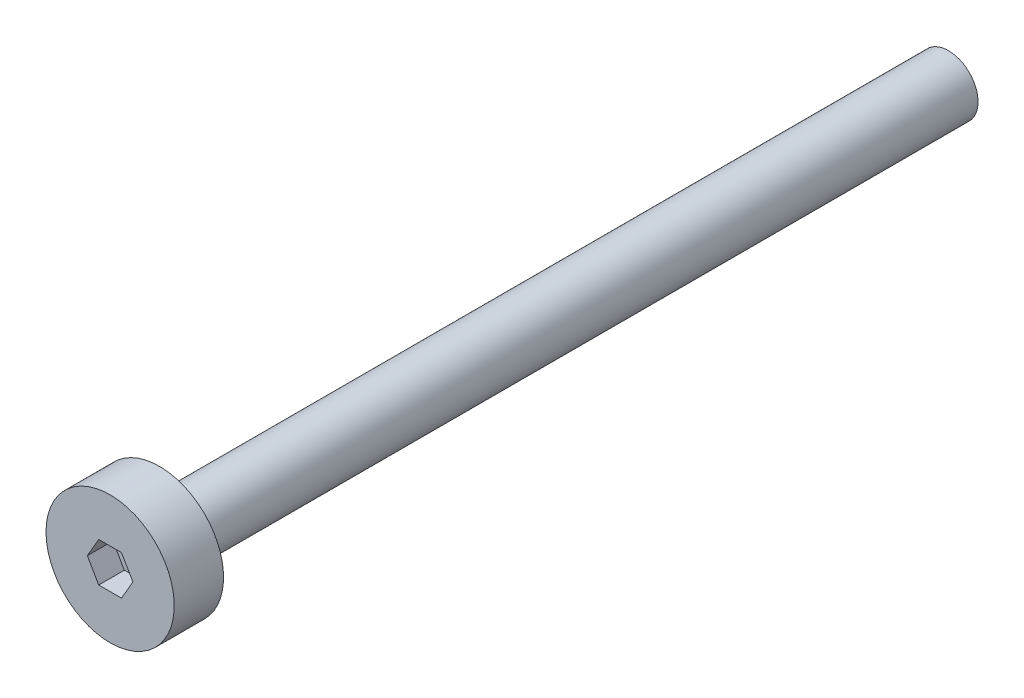
ISO-10303-21;
HEADER;
FILE_DESCRIPTION(('STEP AP214'),'2;1');
FILE_NAME('part.step','',(''),(''),'','','');
FILE_SCHEMA(('AUTOMOTIVE_DESIGN { 1 0 10303 214 1 1 1 1 }'));
ENDSEC;
DATA;
#1=APPLICATION_CONTEXT('core data for automotive mechanical design processes');
#2=APPLICATION_PROTOCOL_DEFINITION('international standard','automotive_design',2000,#1);
#3=PRODUCT_CONTEXT('',#1,'mechanical');
#4=PRODUCT('Part','Part','',(#3));
#5=PRODUCT_RELATED_PRODUCT_CATEGORY('part','',(#4));
#6=PRODUCT_DEFINITION_FORMATION('','',#4);
#7=PRODUCT_DEFINITION_CONTEXT('part definition',#1,'design');
#8=PRODUCT_DEFINITION('design','',#6,#7);
#9=PRODUCT_DEFINITION_SHAPE('','',#8);
#10=(LENGTH_UNIT() NAMED_UNIT(*) SI_UNIT(.MILLI.,.METRE.));
#11=(NAMED_UNIT(*) PLANE_ANGLE_UNIT() SI_UNIT($,.RADIAN.));
#12=(NAMED_UNIT(*) SI_UNIT($,.STERADIAN.) SOLID_ANGLE_UNIT());
#13=UNCERTAINTY_MEASURE_WITH_UNIT(LENGTH_MEASURE(1.E-05),#10,'distance_accuracy_value','');
#14=(GEOMETRIC_REPRESENTATION_CONTEXT(3) GLOBAL_UNCERTAINTY_ASSIGNED_CONTEXT((#13)) GLOBAL_UNIT_ASSIGNED_CONTEXT((#10,
#11,#12)) REPRESENTATION_CONTEXT('',''));
#15=CARTESIAN_POINT('',(0.,0.,0.));
#16=DIRECTION('',(0.,0.,1.));
#17=DIRECTION('',(1.,0.,0.));
#18=AXIS2_PLACEMENT_3D('',#15,#16,#17);
#19=CARTESIAN_POINT('',(0.,0.,1.2));
#20=DIRECTION('',(0.,0.,1.));
#21=DIRECTION('',(1.,0.,0.));
#22=AXIS2_PLACEMENT_3D('',#19,#20,#21);
#23=PLANE('',#22);
#24=DIRECTION('',(-0.50000000000019,0.866025403784329,0.));
#25=VECTOR('',#24,1.);
#26=CARTESIAN_POINT('',(1.154700538379,0.,1.2));
#27=LINE('',#26,#25);
#28=CARTESIAN_POINT('',(1.154700538379,0.,1.2));
#29=VERTEX_POINT('',#28);
#30=CARTESIAN_POINT('',(0.57735026919,1.,1.2));
#31=VERTEX_POINT('',#30);
#32=EDGE_CURVE('E9',#29,#31,#27,.T.);
#33=ORIENTED_EDGE('',*,*,#32,.T.);
#34=DIRECTION('',(-1.,0.,0.));
#35=VECTOR('',#34,1.);
#36=CARTESIAN_POINT('',(0.57735026919,1.,1.2));
#37=LINE('',#36,#35);
#38=CARTESIAN_POINT('',(-0.57735026919,1.,1.2));
#39=VERTEX_POINT('',#38);
#40=EDGE_CURVE('E148',#31,#39,#37,.T.);
#41=ORIENTED_EDGE('',*,*,#40,.T.);
#42=DIRECTION('',(-0.50000000000019,-0.866025403784329,0.));
#43=VECTOR('',#42,1.);
#44=CARTESIAN_POINT('',(-0.57735026919,1.,1.2));
#45=LINE('',#44,#43);
#46=CARTESIAN_POINT('',(-1.154700538379,0.,1.2));
#47=VERTEX_POINT('',#46);
#48=EDGE_CURVE('E144',#39,#47,#45,.T.);
#49=ORIENTED_EDGE('',*,*,#48,.T.);
#50=DIRECTION('',(0.50000000000019,-0.866025403784329,0.));
#51=VECTOR('',#50,1.);
#52=CARTESIAN_POINT('',(-1.154700538379,0.,1.2));
#53=LINE('',#52,#51);
#54=CARTESIAN_POINT('',(-0.57735026919,-1.,1.2));
#55=VERTEX_POINT('',#54);
#56=EDGE_CURVE('E171',#47,#55,#53,.T.);
#57=ORIENTED_EDGE('',*,*,#56,.T.);
#58=DIRECTION('',(1.,0.,0.));
#59=VECTOR('',#58,1.);
#60=CARTESIAN_POINT('',(-0.57735026919,-1.,1.2));
#61=LINE('',#60,#59);
#62=CARTESIAN_POINT('',(0.57735026919,-1.,1.2));
#63=VERTEX_POINT('',#62);
#64=EDGE_CURVE('E69',#55,#63,#61,.T.);
#65=ORIENTED_EDGE('',*,*,#64,.T.);
#66=DIRECTION('',(0.50000000000019,0.866025403784329,0.));
#67=VECTOR('',#66,1.);
#68=CARTESIAN_POINT('',(0.57735026919,-1.,1.2));
#69=LINE('',#68,#67);
#70=EDGE_CURVE('E86',#63,#29,#69,.T.);
#71=ORIENTED_EDGE('',*,*,#70,.T.);
#72=EDGE_LOOP('',(#33,#41,#49,#57,#65,#71));
#73=FACE_BOUND('',#72,.T.);
#74=ADVANCED_FACE('F14',(#73),#23,.T.);
#75=CARTESIAN_POINT('',(0.,0.,-40.));
#76=DIRECTION('',(0.,0.,-1.));
#77=DIRECTION('',(0.,-1.,0.));
#78=AXIS2_PLACEMENT_3D('',#75,#76,#77);
#79=PLANE('',#78);
#80=CARTESIAN_POINT('',(0.,0.,-40.));
#81=DIRECTION('',(0.,0.,-1.));
#82=DIRECTION('',(-1.,0.,0.));
#83=AXIS2_PLACEMENT_3D('',#80,#81,#82);
#84=CIRCLE('',#83,1.5);
#85=CARTESIAN_POINT('',(-1.5,0.,-40.));
#86=VERTEX_POINT('',#85);
#87=EDGE_CURVE('E102',#86,#86,#84,.T.);
#88=ORIENTED_EDGE('',*,*,#87,.T.);
#89=EDGE_LOOP('',(#88));
#90=FACE_BOUND('',#89,.T.);
#91=ADVANCED_FACE('F233',(#90),#79,.T.);
#92=CARTESIAN_POINT('',(1.154700538379,0.,1.2));
#93=DIRECTION('',(-0.866025403784329,-0.50000000000019,0.));
#94=DIRECTION('',(-0.50000000000019,0.866025403784329,0.));
#95=AXIS2_PLACEMENT_3D('',#92,#93,#94);
#96=PLANE('',#95);
#97=ORIENTED_EDGE('',*,*,#32,.F.);
#98=DIRECTION('',(0.,0.,1.));
#99=VECTOR('',#98,1.);
#100=CARTESIAN_POINT('',(1.154700538379,0.,1.2));
#101=LINE('',#100,#99);
#102=CARTESIAN_POINT('',(1.154700538379,0.,2.5));
#103=VERTEX_POINT('',#102);
#104=EDGE_CURVE('E78',#29,#103,#101,.T.);
#105=ORIENTED_EDGE('',*,*,#104,.T.);
#106=DIRECTION('',(-0.50000000000019,0.866025403784329,0.));
#107=VECTOR('',#106,1.);
#108=CARTESIAN_POINT('',(1.010362971082,0.25,2.5));
#109=LINE('',#108,#107);
#110=CARTESIAN_POINT('',(0.57735026919,1.,2.5));
#111=VERTEX_POINT('',#110);
#112=EDGE_CURVE('E123',#103,#111,#109,.T.);
#113=ORIENTED_EDGE('',*,*,#112,.T.);
#114=DIRECTION('',(0.,0.,1.));
#115=VECTOR('',#114,1.);
#116=CARTESIAN_POINT('',(0.57735026919,1.,1.2));
#117=LINE('',#116,#115);
#118=EDGE_CURVE('E25',#31,#111,#117,.T.);
#119=ORIENTED_EDGE('',*,*,#118,.F.);
#120=EDGE_LOOP('',(#97,#105,#113,#119));
#121=FACE_BOUND('',#120,.T.);
#122=ADVANCED_FACE('F76',(#121),#96,.T.);
#123=CARTESIAN_POINT('',(0.57735026919,1.,1.2));
#124=DIRECTION('',(0.,-1.,0.));
#125=DIRECTION('',(-1.,0.,0.));
#126=AXIS2_PLACEMENT_3D('',#123,#124,#125);
#127=PLANE('',#126);
#128=ORIENTED_EDGE('',*,*,#40,.F.);
#129=ORIENTED_EDGE('',*,*,#118,.T.);
#130=DIRECTION('',(-1.,0.,0.));
#131=VECTOR('',#130,1.);
#132=CARTESIAN_POINT('',(0.288675134595,1.,2.5));
#133=LINE('',#132,#131);
#134=CARTESIAN_POINT('',(-0.57735026919,1.,2.5));
#135=VERTEX_POINT('',#134);
#136=EDGE_CURVE('E114',#111,#135,#133,.T.);
#137=ORIENTED_EDGE('',*,*,#136,.T.);
#138=DIRECTION('',(0.,0.,1.));
#139=VECTOR('',#138,1.);
#140=CARTESIAN_POINT('',(-0.57735026919,1.,1.2));
#141=LINE('',#140,#139);
#142=EDGE_CURVE('E18',#39,#135,#141,.T.);
#143=ORIENTED_EDGE('',*,*,#142,.F.);
#144=EDGE_LOOP('',(#128,#129,#137,#143));
#145=FACE_BOUND('',#144,.T.);
#146=ADVANCED_FACE('F160',(#145),#127,.T.);
#147=CARTESIAN_POINT('',(-0.57735026919,1.,1.2));
#148=DIRECTION('',(0.866025403784329,-0.50000000000019,0.));
#149=DIRECTION('',(0.,0.,-1.));
#150=AXIS2_PLACEMENT_3D('',#147,#148,#149);
#151=PLANE('',#150);
#152=ORIENTED_EDGE('',*,*,#48,.F.);
#153=ORIENTED_EDGE('',*,*,#142,.T.);
#154=DIRECTION('',(-0.50000000000019,-0.866025403784329,0.));
#155=VECTOR('',#154,1.);
#156=CARTESIAN_POINT('',(-0.721687836487,0.75,2.5));
#157=LINE('',#156,#155);
#158=CARTESIAN_POINT('',(-1.154700538379,0.,2.5));
#159=VERTEX_POINT('',#158);
#160=EDGE_CURVE('E110',#135,#159,#157,.T.);
#161=ORIENTED_EDGE('',*,*,#160,.T.);
#162=DIRECTION('',(0.,0.,1.));
#163=VECTOR('',#162,1.);
#164=CARTESIAN_POINT('',(-1.154700538379,0.,1.2));
#165=LINE('',#164,#163);
#166=EDGE_CURVE('E147',#47,#159,#165,.T.);
#167=ORIENTED_EDGE('',*,*,#166,.F.);
#168=EDGE_LOOP('',(#152,#153,#161,#167));
#169=FACE_BOUND('',#168,.T.);
#170=ADVANCED_FACE('F16',(#169),#151,.T.);
#171=CARTESIAN_POINT('',(-1.154700538379,0.,1.2));
#172=DIRECTION('',(0.866025403784329,0.50000000000019,0.));
#173=DIRECTION('',(0.,0.,-1.));
#174=AXIS2_PLACEMENT_3D('',#171,#172,#173);
#175=PLANE('',#174);
#176=ORIENTED_EDGE('',*,*,#56,.F.);
#177=ORIENTED_EDGE('',*,*,#166,.T.);
#178=DIRECTION('',(0.50000000000019,-0.866025403784329,0.));
#179=VECTOR('',#178,1.);
#180=CARTESIAN_POINT('',(-1.010362971082,-0.25,2.5));
#181=LINE('',#180,#179);
#182=CARTESIAN_POINT('',(-0.57735026919,-1.,2.5));
#183=VERTEX_POINT('',#182);
#184=EDGE_CURVE('E107',#159,#183,#181,.T.);
#185=ORIENTED_EDGE('',*,*,#184,.T.);
#186=DIRECTION('',(0.,0.,1.));
#187=VECTOR('',#186,1.);
#188=CARTESIAN_POINT('',(-0.57735026919,-1.,1.2));
#189=LINE('',#188,#187);
#190=EDGE_CURVE('E170',#55,#183,#189,.T.);
#191=ORIENTED_EDGE('',*,*,#190,.F.);
#192=EDGE_LOOP('',(#176,#177,#185,#191));
#193=FACE_BOUND('',#192,.T.);
#194=ADVANCED_FACE('F169',(#193),#175,.T.);
#195=CARTESIAN_POINT('',(-0.57735026919,-1.,1.2));
#196=DIRECTION('',(0.,1.,0.));
#197=DIRECTION('',(1.,0.,0.));
#198=AXIS2_PLACEMENT_3D('',#195,#196,#197);
#199=PLANE('',#198);
#200=ORIENTED_EDGE('',*,*,#64,.F.);
#201=ORIENTED_EDGE('',*,*,#190,.T.);
#202=DIRECTION('',(1.,0.,0.));
#203=VECTOR('',#202,1.);
#204=CARTESIAN_POINT('',(-0.288675134595,-1.,2.5));
#205=LINE('',#204,#203);
#206=CARTESIAN_POINT('',(0.57735026919,-1.,2.5));
#207=VERTEX_POINT('',#206);
#208=EDGE_CURVE('E111',#183,#207,#205,.T.);
#209=ORIENTED_EDGE('',*,*,#208,.T.);
#210=DIRECTION('',(0.,0.,1.));
#211=VECTOR('',#210,1.);
#212=CARTESIAN_POINT('',(0.57735026919,-1.,1.2));
#213=LINE('',#212,#211);
#214=EDGE_CURVE('E91',#63,#207,#213,.T.);
#215=ORIENTED_EDGE('',*,*,#214,.F.);
#216=EDGE_LOOP('',(#200,#201,#209,#215));
#217=FACE_BOUND('',#216,.T.);
#218=ADVANCED_FACE('F194',(#217),#199,.T.);
#219=CARTESIAN_POINT('',(0.57735026919,-1.,1.2));
#220=DIRECTION('',(-0.866025403784329,0.50000000000019,0.));
#221=DIRECTION('',(0.,0.,1.));
#222=AXIS2_PLACEMENT_3D('',#219,#220,#221);
#223=PLANE('',#222);
#224=ORIENTED_EDGE('',*,*,#70,.F.);
#225=ORIENTED_EDGE('',*,*,#214,.T.);
#226=DIRECTION('',(0.50000000000019,0.866025403784329,0.));
#227=VECTOR('',#226,1.);
#228=CARTESIAN_POINT('',(0.721687836487,-0.75,2.5));
#229=LINE('',#228,#227);
#230=EDGE_CURVE('E88',#207,#103,#229,.T.);
#231=ORIENTED_EDGE('',*,*,#230,.T.);
#232=ORIENTED_EDGE('',*,*,#104,.F.);
#233=EDGE_LOOP('',(#224,#225,#231,#232));
#234=FACE_BOUND('',#233,.T.);
#235=ADVANCED_FACE('F84',(#234),#223,.T.);
#236=CARTESIAN_POINT('',(0.,0.,0.));
#237=DIRECTION('',(0.,0.,-1.));
#238=DIRECTION('',(-1.,0.,0.));
#239=AXIS2_PLACEMENT_3D('',#236,#237,#238);
#240=CYLINDRICAL_SURFACE('',#239,1.5);
#241=ORIENTED_EDGE('',*,*,#87,.F.);
#242=DIRECTION('',(0.,0.,-1.));
#243=VECTOR('',#242,1.);
#244=CARTESIAN_POINT('',(-1.5,0.,0.));
#245=LINE('',#244,#243);
#246=CARTESIAN_POINT('',(-1.5,0.,0.));
#247=VERTEX_POINT('',#246);
#248=EDGE_CURVE('E94',#247,#86,#245,.T.);
#249=ORIENTED_EDGE('',*,*,#248,.F.);
#250=CARTESIAN_POINT('',(0.,0.,0.));
#251=DIRECTION('',(0.,0.,-1.));
#252=DIRECTION('',(-1.,0.,0.));
#253=AXIS2_PLACEMENT_3D('',#250,#251,#252);
#254=CIRCLE('',#253,1.5);
#255=EDGE_CURVE('E139',#247,#247,#254,.T.);
#256=ORIENTED_EDGE('',*,*,#255,.T.);
#257=ORIENTED_EDGE('',*,*,#248,.T.);
#258=EDGE_LOOP('',(#241,#249,#256,#257));
#259=FACE_BOUND('',#258,.T.);
#260=ADVANCED_FACE('F219',(#259),#240,.T.);
#261=CARTESIAN_POINT('',(0.,0.,2.5));
#262=DIRECTION('',(0.,0.,-1.));
#263=DIRECTION('',(0.,-1.,0.));
#264=AXIS2_PLACEMENT_3D('',#261,#262,#263);
#265=PLANE('',#264);
#266=ORIENTED_EDGE('',*,*,#208,.F.);
#267=ORIENTED_EDGE('',*,*,#184,.F.);
#268=ORIENTED_EDGE('',*,*,#160,.F.);
#269=ORIENTED_EDGE('',*,*,#136,.F.);
#270=ORIENTED_EDGE('',*,*,#112,.F.);
#271=ORIENTED_EDGE('',*,*,#230,.F.);
#272=EDGE_LOOP('',(#266,#267,#268,#269,#270,#271));
#273=FACE_BOUND('',#272,.T.);
#274=CARTESIAN_POINT('',(0.,0.,2.5));
#275=DIRECTION('',(0.,0.,-1.));
#276=DIRECTION('',(-1.,0.,0.));
#277=AXIS2_PLACEMENT_3D('',#274,#275,#276);
#278=CIRCLE('',#277,3.25);
#279=CARTESIAN_POINT('',(-3.25,0.,2.5));
#280=VERTEX_POINT('',#279);
#281=EDGE_CURVE('E136',#280,#280,#278,.T.);
#282=ORIENTED_EDGE('',*,*,#281,.F.);
#283=EDGE_LOOP('',(#282));
#284=FACE_BOUND('',#283,.T.);
#285=ADVANCED_FACE('F163',(#273,#284),#265,.F.);
#286=CARTESIAN_POINT('',(0.,0.,0.));
#287=DIRECTION('',(0.,0.,-1.));
#288=DIRECTION('',(0.,-1.,0.));
#289=AXIS2_PLACEMENT_3D('',#286,#287,#288);
#290=PLANE('',#289);
#291=ORIENTED_EDGE('',*,*,#255,.F.);
#292=EDGE_LOOP('',(#291));
#293=FACE_BOUND('',#292,.T.);
#294=CARTESIAN_POINT('',(0.,0.,0.));
#295=DIRECTION('',(0.,0.,-1.));
#296=DIRECTION('',(-1.,0.,0.));
#297=AXIS2_PLACEMENT_3D('',#294,#295,#296);
#298=CIRCLE('',#297,3.25);
#299=CARTESIAN_POINT('',(-3.25,0.,0.));
#300=VERTEX_POINT('',#299);
#301=EDGE_CURVE('E105',#300,#300,#298,.T.);
#302=ORIENTED_EDGE('',*,*,#301,.T.);
#303=EDGE_LOOP('',(#302));
#304=FACE_BOUND('',#303,.T.);
#305=ADVANCED_FACE('F218',(#293,#304),#290,.T.);
#306=CARTESIAN_POINT('',(0.,0.,2.5));
#307=DIRECTION('',(0.,0.,-1.));
#308=DIRECTION('',(-1.,0.,0.));
#309=AXIS2_PLACEMENT_3D('',#306,#307,#308);
#310=CYLINDRICAL_SURFACE('',#309,3.25);
#311=ORIENTED_EDGE('',*,*,#301,.F.);
#312=DIRECTION('',(0.,0.,-1.));
#313=VECTOR('',#312,1.);
#314=CARTESIAN_POINT('',(-3.25,0.,2.5));
#315=LINE('',#314,#313);
#316=EDGE_CURVE('E140',#280,#300,#315,.T.);
#317=ORIENTED_EDGE('',*,*,#316,.F.);
#318=ORIENTED_EDGE('',*,*,#281,.T.);
#319=ORIENTED_EDGE('',*,*,#316,.T.);
#320=EDGE_LOOP('',(#311,#317,#318,#319));
#321=FACE_BOUND('',#320,.T.);
#322=ADVANCED_FACE('F215',(#321),#310,.T.);
#323=CLOSED_SHELL('',(#74,#91,#122,#146,#170,#194,#218,#235,#260,#285,#305,#322));
#324=MANIFOLD_SOLID_BREP('B1',#323);
#325=ADVANCED_BREP_SHAPE_REPRESENTATION('',(#18,#324),#14);
#326=SHAPE_DEFINITION_REPRESENTATION(#9,#325);
ENDSEC;
END-ISO-10303-21;
